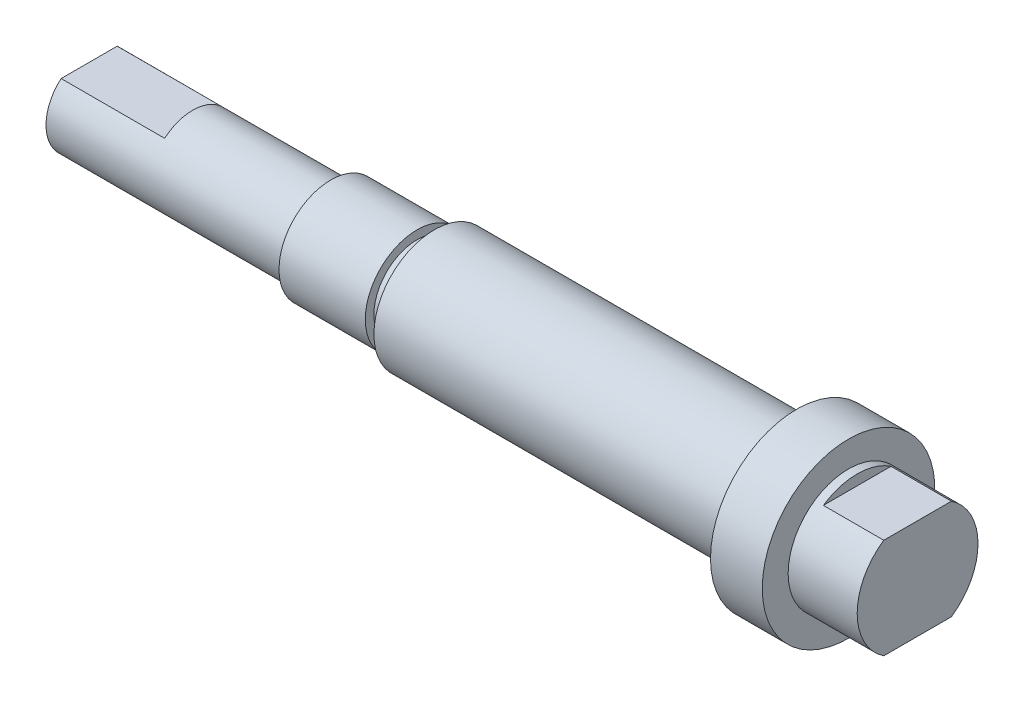
ISO-10303-21;
HEADER;
FILE_DESCRIPTION(('STEP AP214'),'2;1');
FILE_NAME('part.step','',(''),(''),'','','');
FILE_SCHEMA(('AUTOMOTIVE_DESIGN { 1 0 10303 214 1 1 1 1 }'));
ENDSEC;
DATA;
#1=APPLICATION_CONTEXT('core data for automotive mechanical design processes');
#2=APPLICATION_PROTOCOL_DEFINITION('international standard','automotive_design',2000,#1);
#3=PRODUCT_CONTEXT('',#1,'mechanical');
#4=PRODUCT('Part','Part','',(#3));
#5=PRODUCT_RELATED_PRODUCT_CATEGORY('part','',(#4));
#6=PRODUCT_DEFINITION_FORMATION('','',#4);
#7=PRODUCT_DEFINITION_CONTEXT('part definition',#1,'design');
#8=PRODUCT_DEFINITION('design','',#6,#7);
#9=PRODUCT_DEFINITION_SHAPE('','',#8);
#10=(LENGTH_UNIT() NAMED_UNIT(*) SI_UNIT(.MILLI.,.METRE.));
#11=(NAMED_UNIT(*) PLANE_ANGLE_UNIT() SI_UNIT($,.RADIAN.));
#12=(NAMED_UNIT(*) SI_UNIT($,.STERADIAN.) SOLID_ANGLE_UNIT());
#13=UNCERTAINTY_MEASURE_WITH_UNIT(LENGTH_MEASURE(1.E-05),#10,'distance_accuracy_value','');
#14=(GEOMETRIC_REPRESENTATION_CONTEXT(3) GLOBAL_UNCERTAINTY_ASSIGNED_CONTEXT((#13)) GLOBAL_UNIT_ASSIGNED_CONTEXT((#10,
#11,#12)) REPRESENTATION_CONTEXT('',''));
#15=CARTESIAN_POINT('',(0.,0.,0.));
#16=DIRECTION('',(0.,0.,1.));
#17=DIRECTION('',(1.,0.,0.));
#18=AXIS2_PLACEMENT_3D('',#15,#16,#17);
#19=CARTESIAN_POINT('',(50.,0.,0.));
#20=DIRECTION('',(-1.,0.,0.));
#21=DIRECTION('',(0.,0.,1.));
#22=AXIS2_PLACEMENT_3D('',#19,#20,#21);
#23=CYLINDRICAL_SURFACE('',#22,3.5);
#24=CARTESIAN_POINT('',(44.,0.,0.));
#25=DIRECTION('',(-1.,0.,0.));
#26=DIRECTION('',(0.,0.,1.));
#27=AXIS2_PLACEMENT_3D('',#24,#25,#26);
#28=CIRCLE('',#27,3.5);
#29=CARTESIAN_POINT('',(44.,0.,3.5));
#30=VERTEX_POINT('',#29);
#31=EDGE_CURVE('E55',#30,#30,#28,.T.);
#32=ORIENTED_EDGE('',*,*,#31,.F.);
#33=EDGE_LOOP('',(#32));
#34=FACE_BOUND('',#33,.T.);
#35=CARTESIAN_POINT('',(48.,0.,0.));
#36=DIRECTION('',(1.,0.,0.));
#37=DIRECTION('',(0.,0.,-1.));
#38=AXIS2_PLACEMENT_3D('',#35,#36,#37);
#39=CIRCLE('',#38,3.5);
#40=CARTESIAN_POINT('',(48.,2.9,1.95959179422654));
#41=VERTEX_POINT('',#40);
#42=CARTESIAN_POINT('',(48.,-2.9,1.95959179422655));
#43=VERTEX_POINT('',#42);
#44=EDGE_CURVE('E157',#41,#43,#39,.T.);
#45=ORIENTED_EDGE('',*,*,#44,.F.);
#46=DIRECTION('',(1.,0.,0.));
#47=VECTOR('',#46,1.);
#48=CARTESIAN_POINT('',(44.5,2.9,1.95959179422654));
#49=LINE('',#48,#47);
#50=CARTESIAN_POINT('',(44.5,2.9,1.95959179422654));
#51=VERTEX_POINT('',#50);
#52=EDGE_CURVE('E171',#51,#41,#49,.T.);
#53=ORIENTED_EDGE('',*,*,#52,.F.);
#54=CARTESIAN_POINT('',(44.5,0.,0.));
#55=DIRECTION('',(1.,0.,0.));
#56=DIRECTION('',(0.,0.,-1.));
#57=AXIS2_PLACEMENT_3D('',#54,#55,#56);
#58=CIRCLE('',#57,3.5);
#59=CARTESIAN_POINT('',(44.5,2.9,-1.95959179422654));
#60=VERTEX_POINT('',#59);
#61=EDGE_CURVE('E164',#60,#51,#58,.T.);
#62=ORIENTED_EDGE('',*,*,#61,.F.);
#63=DIRECTION('',(1.,0.,0.));
#64=VECTOR('',#63,1.);
#65=CARTESIAN_POINT('',(44.5,2.9,-1.95959179422654));
#66=LINE('',#65,#64);
#67=CARTESIAN_POINT('',(48.,2.9,-1.95959179422654));
#68=VERTEX_POINT('',#67);
#69=EDGE_CURVE('E172',#60,#68,#66,.T.);
#70=ORIENTED_EDGE('',*,*,#69,.T.);
#71=CARTESIAN_POINT('',(48.,0.,0.));
#72=DIRECTION('',(1.,0.,0.));
#73=DIRECTION('',(0.,0.,-1.));
#74=AXIS2_PLACEMENT_3D('',#71,#72,#73);
#75=CIRCLE('',#74,3.5);
#76=CARTESIAN_POINT('',(48.,-2.9,-1.95959179422654));
#77=VERTEX_POINT('',#76);
#78=EDGE_CURVE('E134',#77,#68,#75,.T.);
#79=ORIENTED_EDGE('',*,*,#78,.F.);
#80=DIRECTION('',(1.,0.,0.));
#81=VECTOR('',#80,1.);
#82=CARTESIAN_POINT('',(44.5,-2.9,-1.95959179422654));
#83=LINE('',#82,#81);
#84=CARTESIAN_POINT('',(44.5,-2.9,-1.95959179422654));
#85=VERTEX_POINT('',#84);
#86=EDGE_CURVE('E168',#85,#77,#83,.T.);
#87=ORIENTED_EDGE('',*,*,#86,.F.);
#88=CARTESIAN_POINT('',(44.5,0.,0.));
#89=DIRECTION('',(1.,0.,0.));
#90=DIRECTION('',(0.,0.,-1.));
#91=AXIS2_PLACEMENT_3D('',#88,#89,#90);
#92=CIRCLE('',#91,3.5);
#93=CARTESIAN_POINT('',(44.5,-2.9,1.95959179422654));
#94=VERTEX_POINT('',#93);
#95=EDGE_CURVE('E182',#94,#85,#92,.T.);
#96=ORIENTED_EDGE('',*,*,#95,.F.);
#97=DIRECTION('',(1.,0.,0.));
#98=VECTOR('',#97,1.);
#99=CARTESIAN_POINT('',(44.5,-2.9,1.95959179422654));
#100=LINE('',#99,#98);
#101=EDGE_CURVE('E186',#94,#43,#100,.T.);
#102=ORIENTED_EDGE('',*,*,#101,.T.);
#103=EDGE_LOOP('',(#45,#53,#62,#70,#79,#87,#96,#102));
#104=FACE_BOUND('',#103,.T.);
#105=ADVANCED_FACE('F46',(#34,#104),#23,.T.);
#106=CARTESIAN_POINT('',(44.5,-2.9,0.));
#107=DIRECTION('',(0.,-1.,0.));
#108=DIRECTION('',(0.,0.,-1.));
#109=AXIS2_PLACEMENT_3D('',#106,#107,#108);
#110=PLANE('',#109);
#111=ORIENTED_EDGE('',*,*,#86,.T.);
#112=DIRECTION('',(0.,0.,-1.));
#113=VECTOR('',#112,1.);
#114=CARTESIAN_POINT('',(48.,-2.9,1.95959179422654));
#115=LINE('',#114,#113);
#116=EDGE_CURVE('E160',#43,#77,#115,.T.);
#117=ORIENTED_EDGE('',*,*,#116,.F.);
#118=ORIENTED_EDGE('',*,*,#101,.F.);
#119=DIRECTION('',(0.,0.,-1.));
#120=VECTOR('',#119,1.);
#121=CARTESIAN_POINT('',(44.5,-2.9,0.));
#122=LINE('',#121,#120);
#123=EDGE_CURVE('E163',#94,#85,#122,.T.);
#124=ORIENTED_EDGE('',*,*,#123,.T.);
#125=EDGE_LOOP('',(#111,#117,#118,#124));
#126=FACE_BOUND('',#125,.T.);
#127=ADVANCED_FACE('F259',(#126),#110,.T.);
#128=CARTESIAN_POINT('',(44.5,2.9,0.));
#129=DIRECTION('',(0.,-1.,0.));
#130=DIRECTION('',(0.,0.,-1.));
#131=AXIS2_PLACEMENT_3D('',#128,#129,#130);
#132=PLANE('',#131);
#133=DIRECTION('',(0.,0.,1.));
#134=VECTOR('',#133,1.);
#135=CARTESIAN_POINT('',(48.,2.9,-1.95959179422654));
#136=LINE('',#135,#134);
#137=EDGE_CURVE('E154',#68,#41,#136,.T.);
#138=ORIENTED_EDGE('',*,*,#137,.F.);
#139=ORIENTED_EDGE('',*,*,#69,.F.);
#140=DIRECTION('',(0.,0.,-1.));
#141=VECTOR('',#140,1.);
#142=CARTESIAN_POINT('',(44.5,2.9,0.));
#143=LINE('',#142,#141);
#144=EDGE_CURVE('E167',#51,#60,#143,.T.);
#145=ORIENTED_EDGE('',*,*,#144,.F.);
#146=ORIENTED_EDGE('',*,*,#52,.T.);
#147=EDGE_LOOP('',(#138,#139,#145,#146));
#148=FACE_BOUND('',#147,.T.);
#149=ADVANCED_FACE('F265',(#148),#132,.F.);
#150=CARTESIAN_POINT('',(20.,0.,0.));
#151=DIRECTION('',(-1.,0.,0.));
#152=DIRECTION('',(0.,0.,1.));
#153=AXIS2_PLACEMENT_3D('',#150,#151,#152);
#154=CYLINDRICAL_SURFACE('',#153,2.5);
#155=CARTESIAN_POINT('',(20.,0.,0.));
#156=DIRECTION('',(-1.,0.,0.));
#157=DIRECTION('',(0.,0.,1.));
#158=AXIS2_PLACEMENT_3D('',#155,#156,#157);
#159=CIRCLE('',#158,2.5);
#160=CARTESIAN_POINT('',(20.,0.,2.5));
#161=VERTEX_POINT('',#160);
#162=EDGE_CURVE('E201',#161,#161,#159,.T.);
#163=ORIENTED_EDGE('',*,*,#162,.T.);
#164=EDGE_LOOP('',(#163));
#165=FACE_BOUND('',#164,.T.);
#166=CARTESIAN_POINT('',(19.,0.,0.));
#167=DIRECTION('',(-1.,0.,0.));
#168=DIRECTION('',(0.,0.,1.));
#169=AXIS2_PLACEMENT_3D('',#166,#167,#168);
#170=CIRCLE('',#169,2.5);
#171=CARTESIAN_POINT('',(19.,0.,2.5));
#172=VERTEX_POINT('',#171);
#173=EDGE_CURVE('E197',#172,#172,#170,.F.);
#174=ORIENTED_EDGE('',*,*,#173,.T.);
#175=EDGE_LOOP('',(#174));
#176=FACE_BOUND('',#175,.T.);
#177=ADVANCED_FACE('F231',(#165,#176),#154,.T.);
#178=CARTESIAN_POINT('',(41.,0.,0.));
#179=DIRECTION('',(-1.,0.,0.));
#180=DIRECTION('',(0.,0.,1.));
#181=AXIS2_PLACEMENT_3D('',#178,#179,#180);
#182=CIRCLE('',#181,3.5);
#183=CARTESIAN_POINT('',(41.,0.,3.5));
#184=VERTEX_POINT('',#183);
#185=EDGE_CURVE('E218',#184,#184,#182,.T.);
#186=ORIENTED_EDGE('',*,*,#185,.T.);
#187=EDGE_LOOP('',(#186));
#188=FACE_BOUND('',#187,.T.);
#189=CARTESIAN_POINT('',(20.,0.,0.));
#190=DIRECTION('',(-1.,0.,0.));
#191=DIRECTION('',(0.,0.,1.));
#192=AXIS2_PLACEMENT_3D('',#189,#190,#191);
#193=CIRCLE('',#192,3.5);
#194=CARTESIAN_POINT('',(20.,0.,3.5));
#195=VERTEX_POINT('',#194);
#196=EDGE_CURVE('E205',#195,#195,#193,.T.);
#197=ORIENTED_EDGE('',*,*,#196,.F.);
#198=EDGE_LOOP('',(#197));
#199=FACE_BOUND('',#198,.T.);
#200=ADVANCED_FACE('F48',(#188,#199),#23,.T.);
#201=CARTESIAN_POINT('',(41.,0.,0.));
#202=DIRECTION('',(1.,0.,0.));
#203=DIRECTION('',(0.,0.,-1.));
#204=AXIS2_PLACEMENT_3D('',#201,#202,#203);
#205=CYLINDRICAL_SURFACE('',#204,5.);
#206=CARTESIAN_POINT('',(41.,0.,0.));
#207=DIRECTION('',(-1.,0.,0.));
#208=DIRECTION('',(0.,0.,1.));
#209=AXIS2_PLACEMENT_3D('',#206,#207,#208);
#210=CIRCLE('',#209,5.);
#211=CARTESIAN_POINT('',(41.,0.,5.));
#212=VERTEX_POINT('',#211);
#213=EDGE_CURVE('E214',#212,#212,#210,.T.);
#214=ORIENTED_EDGE('',*,*,#213,.F.);
#215=EDGE_LOOP('',(#214));
#216=FACE_BOUND('',#215,.T.);
#217=CARTESIAN_POINT('',(44.,0.,0.));
#218=DIRECTION('',(-1.,0.,0.));
#219=DIRECTION('',(0.,0.,1.));
#220=AXIS2_PLACEMENT_3D('',#217,#218,#219);
#221=CIRCLE('',#220,5.);
#222=CARTESIAN_POINT('',(44.,0.,5.));
#223=VERTEX_POINT('',#222);
#224=EDGE_CURVE('E213',#223,#223,#221,.T.);
#225=ORIENTED_EDGE('',*,*,#224,.T.);
#226=EDGE_LOOP('',(#225));
#227=FACE_BOUND('',#226,.T.);
#228=ADVANCED_FACE('F271',(#216,#227),#205,.T.);
#229=CARTESIAN_POINT('',(41.,0.,0.));
#230=DIRECTION('',(-1.,0.,0.));
#231=DIRECTION('',(0.,0.,1.));
#232=AXIS2_PLACEMENT_3D('',#229,#230,#231);
#233=PLANE('',#232);
#234=ORIENTED_EDGE('',*,*,#185,.F.);
#235=EDGE_LOOP('',(#234));
#236=FACE_BOUND('',#235,.T.);
#237=ORIENTED_EDGE('',*,*,#213,.T.);
#238=EDGE_LOOP('',(#237));
#239=FACE_BOUND('',#238,.T.);
#240=ADVANCED_FACE('F277',(#236,#239),#233,.T.);
#241=CARTESIAN_POINT('',(44.,0.,0.));
#242=DIRECTION('',(-1.,0.,0.));
#243=DIRECTION('',(0.,0.,1.));
#244=AXIS2_PLACEMENT_3D('',#241,#242,#243);
#245=PLANE('',#244);
#246=ORIENTED_EDGE('',*,*,#31,.T.);
#247=EDGE_LOOP('',(#246));
#248=FACE_BOUND('',#247,.T.);
#249=ORIENTED_EDGE('',*,*,#224,.F.);
#250=EDGE_LOOP('',(#249));
#251=FACE_BOUND('',#250,.T.);
#252=ADVANCED_FACE('F253',(#248,#251),#245,.F.);
#253=CARTESIAN_POINT('',(20.,0.,0.));
#254=DIRECTION('',(-1.,0.,0.));
#255=DIRECTION('',(0.,0.,1.));
#256=AXIS2_PLACEMENT_3D('',#253,#254,#255);
#257=PLANE('',#256);
#258=ORIENTED_EDGE('',*,*,#162,.F.);
#259=EDGE_LOOP('',(#258));
#260=FACE_BOUND('',#259,.T.);
#261=ORIENTED_EDGE('',*,*,#196,.T.);
#262=EDGE_LOOP('',(#261));
#263=FACE_BOUND('',#262,.T.);
#264=ADVANCED_FACE('F243',(#260,#263),#257,.T.);
#265=CARTESIAN_POINT('',(14.,0.,0.));
#266=DIRECTION('',(1.,0.,0.));
#267=DIRECTION('',(0.,0.,-1.));
#268=AXIS2_PLACEMENT_3D('',#265,#266,#267);
#269=CYLINDRICAL_SURFACE('',#268,3.);
#270=CARTESIAN_POINT('',(14.,0.,0.));
#271=DIRECTION('',(-1.,0.,0.));
#272=DIRECTION('',(0.,0.,1.));
#273=AXIS2_PLACEMENT_3D('',#270,#271,#272);
#274=CIRCLE('',#273,3.);
#275=CARTESIAN_POINT('',(14.,0.,3.));
#276=VERTEX_POINT('',#275);
#277=EDGE_CURVE('E193',#276,#276,#274,.T.);
#278=ORIENTED_EDGE('',*,*,#277,.F.);
#279=EDGE_LOOP('',(#278));
#280=FACE_BOUND('',#279,.T.);
#281=CARTESIAN_POINT('',(19.,0.,0.));
#282=DIRECTION('',(-1.,0.,0.));
#283=DIRECTION('',(0.,0.,1.));
#284=AXIS2_PLACEMENT_3D('',#281,#282,#283);
#285=CIRCLE('',#284,3.);
#286=CARTESIAN_POINT('',(19.,0.,3.));
#287=VERTEX_POINT('',#286);
#288=EDGE_CURVE('E176',#287,#287,#285,.T.);
#289=ORIENTED_EDGE('',*,*,#288,.T.);
#290=EDGE_LOOP('',(#289));
#291=FACE_BOUND('',#290,.T.);
#292=ADVANCED_FACE('F241',(#280,#291),#269,.T.);
#293=CARTESIAN_POINT('',(14.,0.,0.));
#294=DIRECTION('',(-1.,0.,0.));
#295=DIRECTION('',(0.,0.,1.));
#296=AXIS2_PLACEMENT_3D('',#293,#294,#295);
#297=PLANE('',#296);
#298=CARTESIAN_POINT('',(14.,0.,0.));
#299=DIRECTION('',(-1.,0.,0.));
#300=DIRECTION('',(0.,0.,1.));
#301=AXIS2_PLACEMENT_3D('',#298,#299,#300);
#302=CIRCLE('',#301,2.5);
#303=CARTESIAN_POINT('',(14.,0.,2.5));
#304=VERTEX_POINT('',#303);
#305=EDGE_CURVE('E12',#304,#304,#302,.F.);
#306=ORIENTED_EDGE('',*,*,#305,.T.);
#307=EDGE_LOOP('',(#306));
#308=FACE_BOUND('',#307,.T.);
#309=ORIENTED_EDGE('',*,*,#277,.T.);
#310=EDGE_LOOP('',(#309));
#311=FACE_BOUND('',#310,.T.);
#312=ADVANCED_FACE('F237',(#308,#311),#297,.T.);
#313=CARTESIAN_POINT('',(19.,0.,0.));
#314=DIRECTION('',(-1.,0.,0.));
#315=DIRECTION('',(0.,0.,1.));
#316=AXIS2_PLACEMENT_3D('',#313,#314,#315);
#317=PLANE('',#316);
#318=ORIENTED_EDGE('',*,*,#173,.F.);
#319=EDGE_LOOP('',(#318));
#320=FACE_BOUND('',#319,.T.);
#321=ORIENTED_EDGE('',*,*,#288,.F.);
#322=EDGE_LOOP('',(#321));
#323=FACE_BOUND('',#322,.T.);
#324=ADVANCED_FACE('F233',(#320,#323),#317,.F.);
#325=CARTESIAN_POINT('',(0.,0.,0.));
#326=DIRECTION('',(1.,0.,0.));
#327=DIRECTION('',(0.,0.,-1.));
#328=AXIS2_PLACEMENT_3D('',#325,#326,#327);
#329=PLANE('',#328);
#330=CARTESIAN_POINT('',(0.,0.,0.));
#331=DIRECTION('',(-1.,0.,0.));
#332=DIRECTION('',(0.,0.,1.));
#333=AXIS2_PLACEMENT_3D('',#330,#331,#332);
#334=CIRCLE('',#333,2.5);
#335=CARTESIAN_POINT('',(0.,-1.9,1.62480768092719));
#336=VERTEX_POINT('',#335);
#337=CARTESIAN_POINT('',(0.,1.9,1.62480768092719));
#338=VERTEX_POINT('',#337);
#339=EDGE_CURVE('E206',#336,#338,#334,.T.);
#340=ORIENTED_EDGE('',*,*,#339,.T.);
#341=DIRECTION('',(0.,0.,1.));
#342=VECTOR('',#341,1.);
#343=CARTESIAN_POINT('',(0.,1.9,0.));
#344=LINE('',#343,#342);
#345=CARTESIAN_POINT('',(0.,1.9,-1.62480768092719));
#346=VERTEX_POINT('',#345);
#347=EDGE_CURVE('E116',#346,#338,#344,.T.);
#348=ORIENTED_EDGE('',*,*,#347,.F.);
#349=CARTESIAN_POINT('',(0.,-1.9,-1.62480768092719));
#350=VERTEX_POINT('',#349);
#351=EDGE_CURVE('E130',#346,#350,#334,.T.);
#352=ORIENTED_EDGE('',*,*,#351,.T.);
#353=DIRECTION('',(0.,0.,-1.));
#354=VECTOR('',#353,1.);
#355=CARTESIAN_POINT('',(0.,-1.9,0.));
#356=LINE('',#355,#354);
#357=EDGE_CURVE('E141',#336,#350,#356,.T.);
#358=ORIENTED_EDGE('',*,*,#357,.F.);
#359=EDGE_LOOP('',(#340,#348,#352,#358));
#360=FACE_BOUND('',#359,.T.);
#361=ADVANCED_FACE('F236',(#360),#329,.F.);
#362=DIRECTION('',(-1.,0.,0.));
#363=VECTOR('',#362,1.);
#364=CARTESIAN_POINT('',(6.,1.9,1.62480768092719));
#365=LINE('',#364,#363);
#366=CARTESIAN_POINT('',(6.,1.9,1.62480768092719));
#367=VERTEX_POINT('',#366);
#368=EDGE_CURVE('E122',#367,#338,#365,.T.);
#369=ORIENTED_EDGE('',*,*,#368,.T.);
#370=ORIENTED_EDGE('',*,*,#339,.F.);
#371=DIRECTION('',(-1.,0.,0.));
#372=VECTOR('',#371,1.);
#373=CARTESIAN_POINT('',(6.,-1.9,1.62480768092719));
#374=LINE('',#373,#372);
#375=CARTESIAN_POINT('',(6.,-1.9,1.62480768092719));
#376=VERTEX_POINT('',#375);
#377=EDGE_CURVE('E144',#376,#336,#374,.T.);
#378=ORIENTED_EDGE('',*,*,#377,.F.);
#379=CARTESIAN_POINT('',(6.,0.,0.));
#380=DIRECTION('',(-1.,0.,0.));
#381=DIRECTION('',(0.,0.,1.));
#382=AXIS2_PLACEMENT_3D('',#379,#380,#381);
#383=CIRCLE('',#382,2.5);
#384=CARTESIAN_POINT('',(6.,-1.9,-1.62480768092719));
#385=VERTEX_POINT('',#384);
#386=EDGE_CURVE('E138',#385,#376,#383,.T.);
#387=ORIENTED_EDGE('',*,*,#386,.F.);
#388=DIRECTION('',(-1.,0.,0.));
#389=VECTOR('',#388,1.);
#390=CARTESIAN_POINT('',(6.,-1.9,-1.62480768092719));
#391=LINE('',#390,#389);
#392=EDGE_CURVE('E147',#385,#350,#391,.T.);
#393=ORIENTED_EDGE('',*,*,#392,.T.);
#394=ORIENTED_EDGE('',*,*,#351,.F.);
#395=DIRECTION('',(-1.,0.,0.));
#396=VECTOR('',#395,1.);
#397=CARTESIAN_POINT('',(6.,1.9,-1.62480768092719));
#398=LINE('',#397,#396);
#399=CARTESIAN_POINT('',(6.,1.9,-1.62480768092719));
#400=VERTEX_POINT('',#399);
#401=EDGE_CURVE('E120',#400,#346,#398,.T.);
#402=ORIENTED_EDGE('',*,*,#401,.F.);
#403=CARTESIAN_POINT('',(6.,0.,0.));
#404=DIRECTION('',(-1.,0.,0.));
#405=DIRECTION('',(0.,0.,1.));
#406=AXIS2_PLACEMENT_3D('',#403,#404,#405);
#407=CIRCLE('',#406,2.5);
#408=EDGE_CURVE('E110',#367,#400,#407,.T.);
#409=ORIENTED_EDGE('',*,*,#408,.F.);
#410=EDGE_LOOP('',(#369,#370,#378,#387,#393,#394,#402,#409));
#411=FACE_BOUND('',#410,.T.);
#412=ORIENTED_EDGE('',*,*,#305,.F.);
#413=EDGE_LOOP('',(#412));
#414=FACE_BOUND('',#413,.T.);
#415=ADVANCED_FACE('F126',(#411,#414),#154,.T.);
#416=CARTESIAN_POINT('',(44.5,0.,0.));
#417=DIRECTION('',(1.,0.,0.));
#418=DIRECTION('',(0.,0.,-1.));
#419=AXIS2_PLACEMENT_3D('',#416,#417,#418);
#420=PLANE('',#419);
#421=ORIENTED_EDGE('',*,*,#123,.F.);
#422=ORIENTED_EDGE('',*,*,#95,.T.);
#423=EDGE_LOOP('',(#421,#422));
#424=FACE_BOUND('',#423,.T.);
#425=ADVANCED_FACE('F303',(#424),#420,.T.);
#426=CARTESIAN_POINT('',(44.5,0.,0.));
#427=DIRECTION('',(1.,0.,0.));
#428=DIRECTION('',(0.,0.,-1.));
#429=AXIS2_PLACEMENT_3D('',#426,#427,#428);
#430=PLANE('',#429);
#431=ORIENTED_EDGE('',*,*,#61,.T.);
#432=ORIENTED_EDGE('',*,*,#144,.T.);
#433=EDGE_LOOP('',(#431,#432));
#434=FACE_BOUND('',#433,.T.);
#435=ADVANCED_FACE('F319',(#434),#430,.T.);
#436=CARTESIAN_POINT('',(48.,0.,0.));
#437=DIRECTION('',(1.,0.,0.));
#438=DIRECTION('',(0.,0.,-1.));
#439=AXIS2_PLACEMENT_3D('',#436,#437,#438);
#440=PLANE('',#439);
#441=ORIENTED_EDGE('',*,*,#78,.T.);
#442=ORIENTED_EDGE('',*,*,#137,.T.);
#443=ORIENTED_EDGE('',*,*,#44,.T.);
#444=ORIENTED_EDGE('',*,*,#116,.T.);
#445=EDGE_LOOP('',(#441,#442,#443,#444));
#446=FACE_BOUND('',#445,.T.);
#447=ADVANCED_FACE('F313',(#446),#440,.T.);
#448=CARTESIAN_POINT('',(6.,-1.9,0.));
#449=DIRECTION('',(0.,1.,0.));
#450=DIRECTION('',(0.,0.,1.));
#451=AXIS2_PLACEMENT_3D('',#448,#449,#450);
#452=PLANE('',#451);
#453=ORIENTED_EDGE('',*,*,#357,.T.);
#454=ORIENTED_EDGE('',*,*,#392,.F.);
#455=DIRECTION('',(0.,0.,-1.));
#456=VECTOR('',#455,1.);
#457=CARTESIAN_POINT('',(6.,-1.9,0.));
#458=LINE('',#457,#456);
#459=EDGE_CURVE('E68',#376,#385,#458,.T.);
#460=ORIENTED_EDGE('',*,*,#459,.F.);
#461=ORIENTED_EDGE('',*,*,#377,.T.);
#462=EDGE_LOOP('',(#453,#454,#460,#461));
#463=FACE_BOUND('',#462,.T.);
#464=ADVANCED_FACE('F309',(#463),#452,.F.);
#465=CARTESIAN_POINT('',(6.,0.,0.));
#466=DIRECTION('',(-1.,0.,0.));
#467=DIRECTION('',(0.,0.,1.));
#468=AXIS2_PLACEMENT_3D('',#465,#466,#467);
#469=PLANE('',#468);
#470=ORIENTED_EDGE('',*,*,#386,.T.);
#471=ORIENTED_EDGE('',*,*,#459,.T.);
#472=EDGE_LOOP('',(#470,#471));
#473=FACE_BOUND('',#472,.T.);
#474=ADVANCED_FACE('F312',(#473),#469,.T.);
#475=CARTESIAN_POINT('',(6.,1.9,0.));
#476=DIRECTION('',(0.,-1.,0.));
#477=DIRECTION('',(0.,0.,-1.));
#478=AXIS2_PLACEMENT_3D('',#475,#476,#477);
#479=PLANE('',#478);
#480=ORIENTED_EDGE('',*,*,#347,.T.);
#481=ORIENTED_EDGE('',*,*,#368,.F.);
#482=DIRECTION('',(0.,0.,1.));
#483=VECTOR('',#482,1.);
#484=CARTESIAN_POINT('',(6.,1.9,0.));
#485=LINE('',#484,#483);
#486=EDGE_CURVE('E61',#400,#367,#485,.T.);
#487=ORIENTED_EDGE('',*,*,#486,.F.);
#488=ORIENTED_EDGE('',*,*,#401,.T.);
#489=EDGE_LOOP('',(#480,#481,#487,#488));
#490=FACE_BOUND('',#489,.T.);
#491=ADVANCED_FACE('F119',(#490),#479,.F.);
#492=CARTESIAN_POINT('',(6.,0.,0.));
#493=DIRECTION('',(-1.,0.,0.));
#494=DIRECTION('',(0.,0.,1.));
#495=AXIS2_PLACEMENT_3D('',#492,#493,#494);
#496=PLANE('',#495);
#497=ORIENTED_EDGE('',*,*,#408,.T.);
#498=ORIENTED_EDGE('',*,*,#486,.T.);
#499=EDGE_LOOP('',(#497,#498));
#500=FACE_BOUND('',#499,.T.);
#501=ADVANCED_FACE('F111',(#500),#496,.T.);
#502=CLOSED_SHELL('',(#105,#127,#149,#177,#200,#228,#240,#252,#264,#292,#312,#324,#361,#415,
#425,#435,#447,#464,#474,#491,#501));
#503=MANIFOLD_SOLID_BREP('B2',#502);
#504=ADVANCED_BREP_SHAPE_REPRESENTATION('',(#18,#503),#14);
#505=SHAPE_DEFINITION_REPRESENTATION(#9,#504);
ENDSEC;
END-ISO-10303-21;
